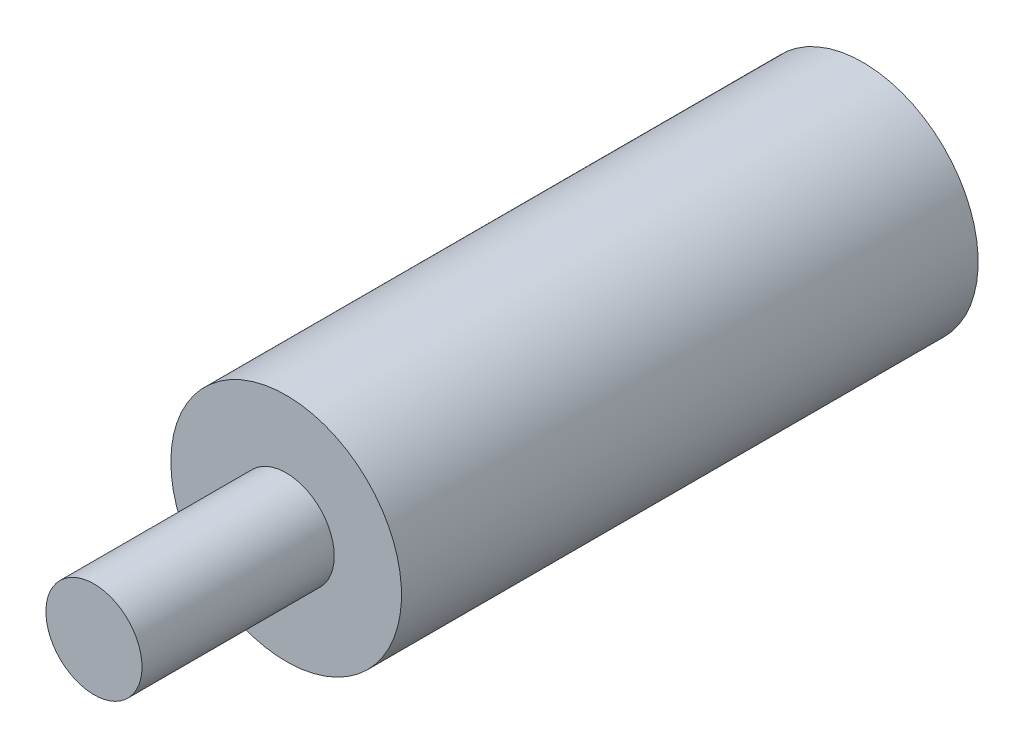
ISO-10303-21;
HEADER;
FILE_DESCRIPTION(('STEP AP214'),'2;1');
FILE_NAME('part.step','',(''),(''),'','','');
FILE_SCHEMA(('AUTOMOTIVE_DESIGN { 1 0 10303 214 1 1 1 1 }'));
ENDSEC;
DATA;
#1=APPLICATION_CONTEXT('core data for automotive mechanical design processes');
#2=APPLICATION_PROTOCOL_DEFINITION('international standard','automotive_design',2000,#1);
#3=PRODUCT_CONTEXT('',#1,'mechanical');
#4=PRODUCT('Part','Part','',(#3));
#5=PRODUCT_RELATED_PRODUCT_CATEGORY('part','',(#4));
#6=PRODUCT_DEFINITION_FORMATION('','',#4);
#7=PRODUCT_DEFINITION_CONTEXT('part definition',#1,'design');
#8=PRODUCT_DEFINITION('design','',#6,#7);
#9=PRODUCT_DEFINITION_SHAPE('','',#8);
#10=(LENGTH_UNIT() NAMED_UNIT(*) SI_UNIT(.MILLI.,.METRE.));
#11=(NAMED_UNIT(*) PLANE_ANGLE_UNIT() SI_UNIT($,.RADIAN.));
#12=(NAMED_UNIT(*) SI_UNIT($,.STERADIAN.) SOLID_ANGLE_UNIT());
#13=UNCERTAINTY_MEASURE_WITH_UNIT(LENGTH_MEASURE(1.E-05),#10,'distance_accuracy_value','');
#14=(GEOMETRIC_REPRESENTATION_CONTEXT(3) GLOBAL_UNCERTAINTY_ASSIGNED_CONTEXT((#13)) GLOBAL_UNIT_ASSIGNED_CONTEXT((#10,
#11,#12)) REPRESENTATION_CONTEXT('',''));
#15=CARTESIAN_POINT('',(0.,0.,0.));
#16=DIRECTION('',(0.,0.,1.));
#17=DIRECTION('',(1.,0.,0.));
#18=AXIS2_PLACEMENT_3D('',#15,#16,#17);
#19=CARTESIAN_POINT('',(0.,0.,5.));
#20=DIRECTION('',(0.,0.,-1.));
#21=DIRECTION('',(-1.,0.,0.));
#22=AXIS2_PLACEMENT_3D('',#19,#20,#21);
#23=CYLINDRICAL_SURFACE('',#22,2.5);
#24=CARTESIAN_POINT('',(0.,0.,5.));
#25=DIRECTION('',(0.,0.,1.));
#26=DIRECTION('',(1.,0.,0.));
#27=AXIS2_PLACEMENT_3D('',#24,#25,#26);
#28=CIRCLE('',#27,2.5);
#29=CARTESIAN_POINT('',(2.5,0.,5.));
#30=VERTEX_POINT('',#29);
#31=EDGE_CURVE('E10',#30,#30,#28,.T.);
#32=ORIENTED_EDGE('',*,*,#31,.F.);
#33=EDGE_LOOP('',(#32));
#34=FACE_BOUND('',#33,.T.);
#35=CARTESIAN_POINT('',(0.,0.,-5.));
#36=DIRECTION('',(0.,0.,1.));
#37=DIRECTION('',(1.,0.,0.));
#38=AXIS2_PLACEMENT_3D('',#35,#36,#37);
#39=CIRCLE('',#38,2.5);
#40=CARTESIAN_POINT('',(2.5,0.,-5.));
#41=VERTEX_POINT('',#40);
#42=EDGE_CURVE('E40',#41,#41,#39,.T.);
#43=ORIENTED_EDGE('',*,*,#42,.T.);
#44=EDGE_LOOP('',(#43));
#45=FACE_BOUND('',#44,.T.);
#46=ADVANCED_FACE('F37',(#34,#45),#23,.T.);
#47=CARTESIAN_POINT('',(0.,0.,5.));
#48=DIRECTION('',(0.,0.,1.));
#49=DIRECTION('',(1.,0.,0.));
#50=AXIS2_PLACEMENT_3D('',#47,#48,#49);
#51=PLANE('',#50);
#52=ORIENTED_EDGE('',*,*,#31,.T.);
#53=EDGE_LOOP('',(#52));
#54=FACE_BOUND('',#53,.T.);
#55=ADVANCED_FACE('F60',(#54),#51,.T.);
#56=CARTESIAN_POINT('',(0.,0.,-35.));
#57=DIRECTION('',(0.,0.,1.));
#58=DIRECTION('',(1.,0.,0.));
#59=AXIS2_PLACEMENT_3D('',#56,#57,#58);
#60=CYLINDRICAL_SURFACE('',#59,6.);
#61=CARTESIAN_POINT('',(0.,0.,-35.));
#62=DIRECTION('',(0.,0.,-1.));
#63=DIRECTION('',(-1.,0.,0.));
#64=AXIS2_PLACEMENT_3D('',#61,#62,#63);
#65=CIRCLE('',#64,6.);
#66=CARTESIAN_POINT('',(-6.,0.,-35.));
#67=VERTEX_POINT('',#66);
#68=EDGE_CURVE('E47',#67,#67,#65,.T.);
#69=ORIENTED_EDGE('',*,*,#68,.F.);
#70=EDGE_LOOP('',(#69));
#71=FACE_BOUND('',#70,.T.);
#72=CARTESIAN_POINT('',(0.,0.,-5.));
#73=DIRECTION('',(0.,0.,-1.));
#74=DIRECTION('',(-1.,0.,0.));
#75=AXIS2_PLACEMENT_3D('',#72,#73,#74);
#76=CIRCLE('',#75,6.);
#77=CARTESIAN_POINT('',(-6.,0.,-5.));
#78=VERTEX_POINT('',#77);
#79=EDGE_CURVE('E49',#78,#78,#76,.T.);
#80=ORIENTED_EDGE('',*,*,#79,.T.);
#81=EDGE_LOOP('',(#80));
#82=FACE_BOUND('',#81,.T.);
#83=ADVANCED_FACE('F57',(#71,#82),#60,.T.);
#84=CARTESIAN_POINT('',(0.,0.,-35.));
#85=DIRECTION('',(0.,0.,-1.));
#86=DIRECTION('',(-1.,0.,0.));
#87=AXIS2_PLACEMENT_3D('',#84,#85,#86);
#88=PLANE('',#87);
#89=ORIENTED_EDGE('',*,*,#68,.T.);
#90=EDGE_LOOP('',(#89));
#91=FACE_BOUND('',#90,.T.);
#92=ADVANCED_FACE('F55',(#91),#88,.T.);
#93=CARTESIAN_POINT('',(0.,0.,-5.));
#94=DIRECTION('',(0.,0.,-1.));
#95=DIRECTION('',(-1.,0.,0.));
#96=AXIS2_PLACEMENT_3D('',#93,#94,#95);
#97=PLANE('',#96);
#98=ORIENTED_EDGE('',*,*,#42,.F.);
#99=EDGE_LOOP('',(#98));
#100=FACE_BOUND('',#99,.T.);
#101=ORIENTED_EDGE('',*,*,#79,.F.);
#102=EDGE_LOOP('',(#101));
#103=FACE_BOUND('',#102,.T.);
#104=ADVANCED_FACE('F64',(#100,#103),#97,.F.);
#105=CLOSED_SHELL('',(#46,#55,#83,#92,#104));
#106=MANIFOLD_SOLID_BREP('B2',#105);
#107=ADVANCED_BREP_SHAPE_REPRESENTATION('',(#18,#106),#14);
#108=SHAPE_DEFINITION_REPRESENTATION(#9,#107);
ENDSEC;
END-ISO-10303-21;
